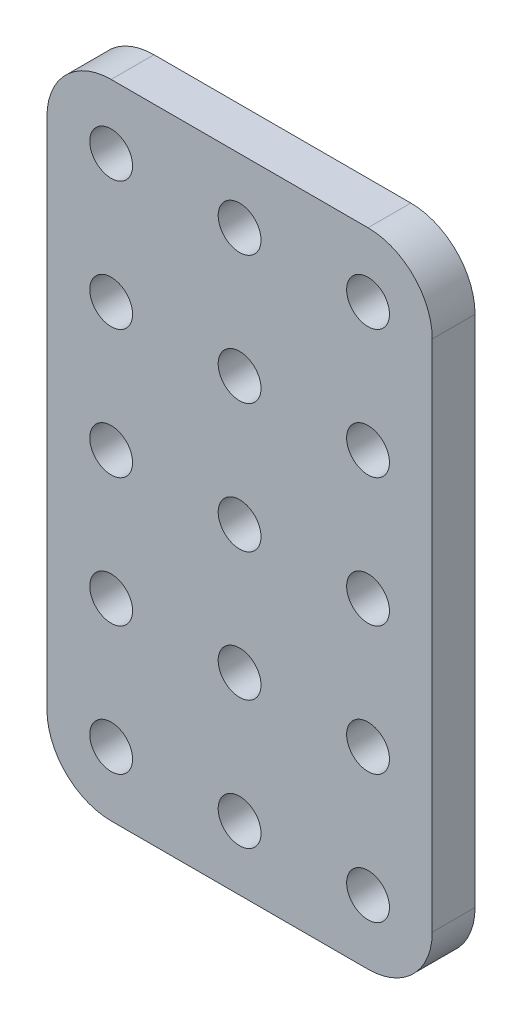
ISO-10303-21;
HEADER;
FILE_DESCRIPTION(('STEP AP214'),'2;1');
FILE_NAME('part.step','',(''),(''),'','','');
FILE_SCHEMA(('AUTOMOTIVE_DESIGN { 1 0 10303 214 1 1 1 1 }'));
ENDSEC;
DATA;
#1=APPLICATION_CONTEXT('core data for automotive mechanical design processes');
#2=APPLICATION_PROTOCOL_DEFINITION('international standard','automotive_design',2000,#1);
#3=PRODUCT_CONTEXT('',#1,'mechanical');
#4=PRODUCT('Part','Part','',(#3));
#5=PRODUCT_RELATED_PRODUCT_CATEGORY('part','',(#4));
#6=PRODUCT_DEFINITION_FORMATION('','',#4);
#7=PRODUCT_DEFINITION_CONTEXT('part definition',#1,'design');
#8=PRODUCT_DEFINITION('design','',#6,#7);
#9=PRODUCT_DEFINITION_SHAPE('','',#8);
#10=(LENGTH_UNIT() NAMED_UNIT(*) SI_UNIT(.MILLI.,.METRE.));
#11=(NAMED_UNIT(*) PLANE_ANGLE_UNIT() SI_UNIT($,.RADIAN.));
#12=(NAMED_UNIT(*) SI_UNIT($,.STERADIAN.) SOLID_ANGLE_UNIT());
#13=UNCERTAINTY_MEASURE_WITH_UNIT(LENGTH_MEASURE(1.E-05),#10,'distance_accuracy_value','');
#14=(GEOMETRIC_REPRESENTATION_CONTEXT(3) GLOBAL_UNCERTAINTY_ASSIGNED_CONTEXT((#13)) GLOBAL_UNIT_ASSIGNED_CONTEXT((#10,
#11,#12)) REPRESENTATION_CONTEXT('',''));
#15=CARTESIAN_POINT('',(0.,0.,0.));
#16=DIRECTION('',(0.,0.,1.));
#17=DIRECTION('',(1.,0.,0.));
#18=AXIS2_PLACEMENT_3D('',#15,#16,#17);
#19=CARTESIAN_POINT('',(-101.443383637,101.056539338,3.));
#20=DIRECTION('',(0.,0.,1.));
#21=DIRECTION('',(1.,0.,0.));
#22=AXIS2_PLACEMENT_3D('',#19,#20,#21);
#23=PLANE('',#22);
#24=CARTESIAN_POINT('',(-92.443383637,65.056539338,3.));
#25=DIRECTION('',(0.,0.,1.));
#26=DIRECTION('',(1.,0.,0.));
#27=AXIS2_PLACEMENT_3D('',#24,#25,#26);
#28=CIRCLE('',#27,1.5);
#29=CARTESIAN_POINT('',(-90.943383637,65.056539338,3.));
#30=VERTEX_POINT('',#29);
#31=EDGE_CURVE('E254',#30,#30,#28,.T.);
#32=ORIENTED_EDGE('',*,*,#31,.F.);
#33=EDGE_LOOP('',(#32));
#34=FACE_BOUND('',#33,.T.);
#35=CARTESIAN_POINT('',(-83.443383637,74.056539338,3.));
#36=DIRECTION('',(0.,0.,1.));
#37=DIRECTION('',(1.,0.,0.));
#38=AXIS2_PLACEMENT_3D('',#35,#36,#37);
#39=CIRCLE('',#38,1.5);
#40=CARTESIAN_POINT('',(-81.943383637,74.056539338,3.));
#41=VERTEX_POINT('',#40);
#42=EDGE_CURVE('E242',#41,#41,#39,.T.);
#43=ORIENTED_EDGE('',*,*,#42,.F.);
#44=EDGE_LOOP('',(#43));
#45=FACE_BOUND('',#44,.T.);
#46=CARTESIAN_POINT('',(-101.443383637,74.056539338,3.));
#47=DIRECTION('',(0.,0.,1.));
#48=DIRECTION('',(1.,0.,0.));
#49=AXIS2_PLACEMENT_3D('',#46,#47,#48);
#50=CIRCLE('',#49,1.5);
#51=CARTESIAN_POINT('',(-99.943383637,74.056539338,3.));
#52=VERTEX_POINT('',#51);
#53=EDGE_CURVE('E230',#52,#52,#50,.T.);
#54=ORIENTED_EDGE('',*,*,#53,.F.);
#55=EDGE_LOOP('',(#54));
#56=FACE_BOUND('',#55,.T.);
#57=CARTESIAN_POINT('',(-92.443383637,83.056539338,3.));
#58=DIRECTION('',(0.,0.,1.));
#59=DIRECTION('',(1.,0.,0.));
#60=AXIS2_PLACEMENT_3D('',#57,#58,#59);
#61=CIRCLE('',#60,1.5);
#62=CARTESIAN_POINT('',(-90.943383637,83.056539338,3.));
#63=VERTEX_POINT('',#62);
#64=EDGE_CURVE('E218',#63,#63,#61,.T.);
#65=ORIENTED_EDGE('',*,*,#64,.F.);
#66=EDGE_LOOP('',(#65));
#67=FACE_BOUND('',#66,.T.);
#68=CARTESIAN_POINT('',(-83.443383637,92.056539338,3.));
#69=DIRECTION('',(0.,0.,1.));
#70=DIRECTION('',(1.,0.,0.));
#71=AXIS2_PLACEMENT_3D('',#68,#69,#70);
#72=CIRCLE('',#71,1.5);
#73=CARTESIAN_POINT('',(-81.943383637,92.056539338,3.));
#74=VERTEX_POINT('',#73);
#75=EDGE_CURVE('E206',#74,#74,#72,.T.);
#76=ORIENTED_EDGE('',*,*,#75,.F.);
#77=EDGE_LOOP('',(#76));
#78=FACE_BOUND('',#77,.T.);
#79=CARTESIAN_POINT('',(-101.443383637,92.056539338,3.));
#80=DIRECTION('',(0.,0.,1.));
#81=DIRECTION('',(1.,0.,0.));
#82=AXIS2_PLACEMENT_3D('',#79,#80,#81);
#83=CIRCLE('',#82,1.5);
#84=CARTESIAN_POINT('',(-99.943383637,92.056539338,3.));
#85=VERTEX_POINT('',#84);
#86=EDGE_CURVE('E194',#85,#85,#83,.T.);
#87=ORIENTED_EDGE('',*,*,#86,.F.);
#88=EDGE_LOOP('',(#87));
#89=FACE_BOUND('',#88,.T.);
#90=CARTESIAN_POINT('',(-92.443383637,101.056539338,3.));
#91=DIRECTION('',(0.,0.,1.));
#92=DIRECTION('',(1.,0.,0.));
#93=AXIS2_PLACEMENT_3D('',#90,#91,#92);
#94=CIRCLE('',#93,1.5);
#95=CARTESIAN_POINT('',(-90.943383637,101.056539338,3.));
#96=VERTEX_POINT('',#95);
#97=EDGE_CURVE('E182',#96,#96,#94,.T.);
#98=ORIENTED_EDGE('',*,*,#97,.F.);
#99=EDGE_LOOP('',(#98));
#100=FACE_BOUND('',#99,.T.);
#101=CARTESIAN_POINT('',(-101.443383637,101.056539338,3.));
#102=DIRECTION('',(0.,0.,1.));
#103=DIRECTION('',(1.,0.,0.));
#104=AXIS2_PLACEMENT_3D('',#101,#102,#103);
#105=CIRCLE('',#104,4.5);
#106=CARTESIAN_POINT('',(-101.443383637,105.556539338,3.));
#107=VERTEX_POINT('',#106);
#108=CARTESIAN_POINT('',(-105.943383637,101.056539338,3.));
#109=VERTEX_POINT('',#108);
#110=EDGE_CURVE('E145',#107,#109,#105,.T.);
#111=ORIENTED_EDGE('',*,*,#110,.T.);
#112=DIRECTION('',(0.,-1.,0.));
#113=VECTOR('',#112,1.);
#114=CARTESIAN_POINT('',(-105.943383637,101.056539338,3.));
#115=LINE('',#114,#113);
#116=CARTESIAN_POINT('',(-105.943383637,65.056539338,3.));
#117=VERTEX_POINT('',#116);
#118=EDGE_CURVE('E93',#109,#117,#115,.T.);
#119=ORIENTED_EDGE('',*,*,#118,.T.);
#120=CARTESIAN_POINT('',(-101.443383637,65.056539338,3.));
#121=DIRECTION('',(0.,0.,1.));
#122=DIRECTION('',(1.,0.,0.));
#123=AXIS2_PLACEMENT_3D('',#120,#121,#122);
#124=CIRCLE('',#123,4.5);
#125=CARTESIAN_POINT('',(-101.443383637,60.556539338,3.));
#126=VERTEX_POINT('',#125);
#127=EDGE_CURVE('E160',#117,#126,#124,.T.);
#128=ORIENTED_EDGE('',*,*,#127,.T.);
#129=DIRECTION('',(1.,0.,0.));
#130=VECTOR('',#129,1.);
#131=CARTESIAN_POINT('',(-101.443383637,60.556539338,3.));
#132=LINE('',#131,#130);
#133=CARTESIAN_POINT('',(-83.443383637,60.556539338,3.));
#134=VERTEX_POINT('',#133);
#135=EDGE_CURVE('E173',#126,#134,#132,.T.);
#136=ORIENTED_EDGE('',*,*,#135,.T.);
#137=CARTESIAN_POINT('',(-83.443383637,65.056539338,3.));
#138=DIRECTION('',(0.,0.,1.));
#139=DIRECTION('',(1.,0.,0.));
#140=AXIS2_PLACEMENT_3D('',#137,#138,#139);
#141=CIRCLE('',#140,4.5);
#142=CARTESIAN_POINT('',(-78.943383637,65.056539338,3.));
#143=VERTEX_POINT('',#142);
#144=EDGE_CURVE('E112',#134,#143,#141,.T.);
#145=ORIENTED_EDGE('',*,*,#144,.T.);
#146=DIRECTION('',(0.,1.,0.));
#147=VECTOR('',#146,1.);
#148=CARTESIAN_POINT('',(-78.943383637,65.056539338,3.));
#149=LINE('',#148,#147);
#150=CARTESIAN_POINT('',(-78.943383637,101.056539338,3.));
#151=VERTEX_POINT('',#150);
#152=EDGE_CURVE('E106',#143,#151,#149,.T.);
#153=ORIENTED_EDGE('',*,*,#152,.T.);
#154=CARTESIAN_POINT('',(-83.443383637,101.056539338,3.));
#155=DIRECTION('',(0.,0.,1.));
#156=DIRECTION('',(1.,0.,0.));
#157=AXIS2_PLACEMENT_3D('',#154,#155,#156);
#158=CIRCLE('',#157,4.5);
#159=CARTESIAN_POINT('',(-83.443383637,105.556539338,3.));
#160=VERTEX_POINT('',#159);
#161=EDGE_CURVE('E110',#151,#160,#158,.T.);
#162=ORIENTED_EDGE('',*,*,#161,.T.);
#163=DIRECTION('',(-1.,0.,0.));
#164=VECTOR('',#163,1.);
#165=CARTESIAN_POINT('',(-83.443383637,105.556539338,3.));
#166=LINE('',#165,#164);
#167=EDGE_CURVE('E50',#160,#107,#166,.T.);
#168=ORIENTED_EDGE('',*,*,#167,.T.);
#169=EDGE_LOOP('',(#111,#119,#128,#136,#145,#153,#162,#168));
#170=FACE_BOUND('',#169,.T.);
#171=CARTESIAN_POINT('',(-101.443383637,101.056539338,3.));
#172=DIRECTION('',(0.,0.,1.));
#173=DIRECTION('',(1.,0.,0.));
#174=AXIS2_PLACEMENT_3D('',#171,#172,#173);
#175=CIRCLE('',#174,1.5);
#176=CARTESIAN_POINT('',(-99.943383637,101.056539338,3.));
#177=VERTEX_POINT('',#176);
#178=EDGE_CURVE('E134',#177,#177,#175,.T.);
#179=ORIENTED_EDGE('',*,*,#178,.F.);
#180=EDGE_LOOP('',(#179));
#181=FACE_BOUND('',#180,.T.);
#182=CARTESIAN_POINT('',(-83.443383637,101.056539338,3.));
#183=DIRECTION('',(0.,0.,1.));
#184=DIRECTION('',(1.,0.,0.));
#185=AXIS2_PLACEMENT_3D('',#182,#183,#184);
#186=CIRCLE('',#185,1.5);
#187=CARTESIAN_POINT('',(-81.943383637,101.056539338,3.));
#188=VERTEX_POINT('',#187);
#189=EDGE_CURVE('E188',#188,#188,#186,.T.);
#190=ORIENTED_EDGE('',*,*,#189,.F.);
#191=EDGE_LOOP('',(#190));
#192=FACE_BOUND('',#191,.T.);
#193=CARTESIAN_POINT('',(-92.443383637,92.056539338,3.));
#194=DIRECTION('',(0.,0.,1.));
#195=DIRECTION('',(1.,0.,0.));
#196=AXIS2_PLACEMENT_3D('',#193,#194,#195);
#197=CIRCLE('',#196,1.5);
#198=CARTESIAN_POINT('',(-90.943383637,92.056539338,3.));
#199=VERTEX_POINT('',#198);
#200=EDGE_CURVE('E200',#199,#199,#197,.T.);
#201=ORIENTED_EDGE('',*,*,#200,.F.);
#202=EDGE_LOOP('',(#201));
#203=FACE_BOUND('',#202,.T.);
#204=CARTESIAN_POINT('',(-101.443383637,83.056539338,3.));
#205=DIRECTION('',(0.,0.,1.));
#206=DIRECTION('',(1.,0.,0.));
#207=AXIS2_PLACEMENT_3D('',#204,#205,#206);
#208=CIRCLE('',#207,1.5);
#209=CARTESIAN_POINT('',(-99.943383637,83.056539338,3.));
#210=VERTEX_POINT('',#209);
#211=EDGE_CURVE('E212',#210,#210,#208,.T.);
#212=ORIENTED_EDGE('',*,*,#211,.F.);
#213=EDGE_LOOP('',(#212));
#214=FACE_BOUND('',#213,.T.);
#215=CARTESIAN_POINT('',(-83.443383637,83.056539338,3.));
#216=DIRECTION('',(0.,0.,1.));
#217=DIRECTION('',(1.,0.,0.));
#218=AXIS2_PLACEMENT_3D('',#215,#216,#217);
#219=CIRCLE('',#218,1.5);
#220=CARTESIAN_POINT('',(-81.943383637,83.056539338,3.));
#221=VERTEX_POINT('',#220);
#222=EDGE_CURVE('E224',#221,#221,#219,.T.);
#223=ORIENTED_EDGE('',*,*,#222,.F.);
#224=EDGE_LOOP('',(#223));
#225=FACE_BOUND('',#224,.T.);
#226=CARTESIAN_POINT('',(-92.443383637,74.056539338,3.));
#227=DIRECTION('',(0.,0.,1.));
#228=DIRECTION('',(1.,0.,0.));
#229=AXIS2_PLACEMENT_3D('',#226,#227,#228);
#230=CIRCLE('',#229,1.5);
#231=CARTESIAN_POINT('',(-90.943383637,74.056539338,3.));
#232=VERTEX_POINT('',#231);
#233=EDGE_CURVE('E236',#232,#232,#230,.T.);
#234=ORIENTED_EDGE('',*,*,#233,.F.);
#235=EDGE_LOOP('',(#234));
#236=FACE_BOUND('',#235,.T.);
#237=CARTESIAN_POINT('',(-101.443383637,65.056539338,3.));
#238=DIRECTION('',(0.,0.,1.));
#239=DIRECTION('',(1.,0.,0.));
#240=AXIS2_PLACEMENT_3D('',#237,#238,#239);
#241=CIRCLE('',#240,1.5);
#242=CARTESIAN_POINT('',(-99.943383637,65.056539338,3.));
#243=VERTEX_POINT('',#242);
#244=EDGE_CURVE('E248',#243,#243,#241,.T.);
#245=ORIENTED_EDGE('',*,*,#244,.F.);
#246=EDGE_LOOP('',(#245));
#247=FACE_BOUND('',#246,.T.);
#248=CARTESIAN_POINT('',(-83.443383637,65.056539338,3.));
#249=DIRECTION('',(0.,0.,1.));
#250=DIRECTION('',(1.,0.,0.));
#251=AXIS2_PLACEMENT_3D('',#248,#249,#250);
#252=CIRCLE('',#251,1.5);
#253=CARTESIAN_POINT('',(-81.943383637,65.056539338,3.));
#254=VERTEX_POINT('',#253);
#255=EDGE_CURVE('E260',#254,#254,#252,.T.);
#256=ORIENTED_EDGE('',*,*,#255,.F.);
#257=EDGE_LOOP('',(#256));
#258=FACE_BOUND('',#257,.T.);
#259=ADVANCED_FACE('F33',(#34,#45,#56,#67,#78,#89,#100,#170,#181,#192,#203,#214,#225,#236,#247,
#258),#23,.T.);
#260=CARTESIAN_POINT('',(-101.443383637,101.056539338,0.));
#261=DIRECTION('',(0.,0.,1.));
#262=DIRECTION('',(1.,0.,0.));
#263=AXIS2_PLACEMENT_3D('',#260,#261,#262);
#264=PLANE('',#263);
#265=CARTESIAN_POINT('',(-92.443383637,65.056539338,0.));
#266=DIRECTION('',(0.,0.,1.));
#267=DIRECTION('',(1.,0.,0.));
#268=AXIS2_PLACEMENT_3D('',#265,#266,#267);
#269=CIRCLE('',#268,1.5);
#270=CARTESIAN_POINT('',(-90.943383637,65.056539338,0.));
#271=VERTEX_POINT('',#270);
#272=EDGE_CURVE('E257',#271,#271,#269,.T.);
#273=ORIENTED_EDGE('',*,*,#272,.T.);
#274=EDGE_LOOP('',(#273));
#275=FACE_BOUND('',#274,.T.);
#276=CARTESIAN_POINT('',(-83.443383637,74.056539338,0.));
#277=DIRECTION('',(0.,0.,1.));
#278=DIRECTION('',(1.,0.,0.));
#279=AXIS2_PLACEMENT_3D('',#276,#277,#278);
#280=CIRCLE('',#279,1.5);
#281=CARTESIAN_POINT('',(-81.943383637,74.056539338,0.));
#282=VERTEX_POINT('',#281);
#283=EDGE_CURVE('E245',#282,#282,#280,.T.);
#284=ORIENTED_EDGE('',*,*,#283,.T.);
#285=EDGE_LOOP('',(#284));
#286=FACE_BOUND('',#285,.T.);
#287=CARTESIAN_POINT('',(-101.443383637,74.056539338,0.));
#288=DIRECTION('',(0.,0.,1.));
#289=DIRECTION('',(1.,0.,0.));
#290=AXIS2_PLACEMENT_3D('',#287,#288,#289);
#291=CIRCLE('',#290,1.5);
#292=CARTESIAN_POINT('',(-99.943383637,74.056539338,0.));
#293=VERTEX_POINT('',#292);
#294=EDGE_CURVE('E233',#293,#293,#291,.T.);
#295=ORIENTED_EDGE('',*,*,#294,.T.);
#296=EDGE_LOOP('',(#295));
#297=FACE_BOUND('',#296,.T.);
#298=CARTESIAN_POINT('',(-92.443383637,83.056539338,0.));
#299=DIRECTION('',(0.,0.,1.));
#300=DIRECTION('',(1.,0.,0.));
#301=AXIS2_PLACEMENT_3D('',#298,#299,#300);
#302=CIRCLE('',#301,1.5);
#303=CARTESIAN_POINT('',(-90.943383637,83.056539338,0.));
#304=VERTEX_POINT('',#303);
#305=EDGE_CURVE('E221',#304,#304,#302,.T.);
#306=ORIENTED_EDGE('',*,*,#305,.T.);
#307=EDGE_LOOP('',(#306));
#308=FACE_BOUND('',#307,.T.);
#309=CARTESIAN_POINT('',(-83.443383637,92.056539338,0.));
#310=DIRECTION('',(0.,0.,1.));
#311=DIRECTION('',(1.,0.,0.));
#312=AXIS2_PLACEMENT_3D('',#309,#310,#311);
#313=CIRCLE('',#312,1.5);
#314=CARTESIAN_POINT('',(-81.943383637,92.056539338,0.));
#315=VERTEX_POINT('',#314);
#316=EDGE_CURVE('E209',#315,#315,#313,.T.);
#317=ORIENTED_EDGE('',*,*,#316,.T.);
#318=EDGE_LOOP('',(#317));
#319=FACE_BOUND('',#318,.T.);
#320=CARTESIAN_POINT('',(-101.443383637,92.056539338,0.));
#321=DIRECTION('',(0.,0.,1.));
#322=DIRECTION('',(1.,0.,0.));
#323=AXIS2_PLACEMENT_3D('',#320,#321,#322);
#324=CIRCLE('',#323,1.5);
#325=CARTESIAN_POINT('',(-99.943383637,92.056539338,0.));
#326=VERTEX_POINT('',#325);
#327=EDGE_CURVE('E197',#326,#326,#324,.T.);
#328=ORIENTED_EDGE('',*,*,#327,.T.);
#329=EDGE_LOOP('',(#328));
#330=FACE_BOUND('',#329,.T.);
#331=CARTESIAN_POINT('',(-92.443383637,101.056539338,0.));
#332=DIRECTION('',(0.,0.,1.));
#333=DIRECTION('',(1.,0.,0.));
#334=AXIS2_PLACEMENT_3D('',#331,#332,#333);
#335=CIRCLE('',#334,1.5);
#336=CARTESIAN_POINT('',(-90.943383637,101.056539338,0.));
#337=VERTEX_POINT('',#336);
#338=EDGE_CURVE('E185',#337,#337,#335,.T.);
#339=ORIENTED_EDGE('',*,*,#338,.T.);
#340=EDGE_LOOP('',(#339));
#341=FACE_BOUND('',#340,.T.);
#342=CARTESIAN_POINT('',(-101.443383637,101.056539338,0.));
#343=DIRECTION('',(0.,0.,1.));
#344=DIRECTION('',(1.,0.,0.));
#345=AXIS2_PLACEMENT_3D('',#342,#343,#344);
#346=CIRCLE('',#345,4.5);
#347=CARTESIAN_POINT('',(-101.443383637,105.556539338,0.));
#348=VERTEX_POINT('',#347);
#349=CARTESIAN_POINT('',(-105.943383637,101.056539338,0.));
#350=VERTEX_POINT('',#349);
#351=EDGE_CURVE('E130',#348,#350,#346,.T.);
#352=ORIENTED_EDGE('',*,*,#351,.F.);
#353=DIRECTION('',(-1.,0.,0.));
#354=VECTOR('',#353,1.);
#355=CARTESIAN_POINT('',(-83.443383637,105.556539338,0.));
#356=LINE('',#355,#354);
#357=CARTESIAN_POINT('',(-83.443383637,105.556539338,0.));
#358=VERTEX_POINT('',#357);
#359=EDGE_CURVE('E85',#358,#348,#356,.T.);
#360=ORIENTED_EDGE('',*,*,#359,.F.);
#361=CARTESIAN_POINT('',(-83.443383637,101.056539338,0.));
#362=DIRECTION('',(0.,0.,1.));
#363=DIRECTION('',(1.,0.,0.));
#364=AXIS2_PLACEMENT_3D('',#361,#362,#363);
#365=CIRCLE('',#364,4.5);
#366=CARTESIAN_POINT('',(-78.943383637,101.056539338,0.));
#367=VERTEX_POINT('',#366);
#368=EDGE_CURVE('E79',#367,#358,#365,.T.);
#369=ORIENTED_EDGE('',*,*,#368,.F.);
#370=DIRECTION('',(0.,1.,0.));
#371=VECTOR('',#370,1.);
#372=CARTESIAN_POINT('',(-78.943383637,65.056539338,0.));
#373=LINE('',#372,#371);
#374=CARTESIAN_POINT('',(-78.943383637,65.056539338,0.));
#375=VERTEX_POINT('',#374);
#376=EDGE_CURVE('E120',#375,#367,#373,.T.);
#377=ORIENTED_EDGE('',*,*,#376,.F.);
#378=CARTESIAN_POINT('',(-83.443383637,65.056539338,0.));
#379=DIRECTION('',(0.,0.,1.));
#380=DIRECTION('',(1.,0.,0.));
#381=AXIS2_PLACEMENT_3D('',#378,#379,#380);
#382=CIRCLE('',#381,4.5);
#383=CARTESIAN_POINT('',(-83.443383637,60.556539338,0.));
#384=VERTEX_POINT('',#383);
#385=EDGE_CURVE('E140',#384,#375,#382,.T.);
#386=ORIENTED_EDGE('',*,*,#385,.F.);
#387=DIRECTION('',(1.,0.,0.));
#388=VECTOR('',#387,1.);
#389=CARTESIAN_POINT('',(-101.443383637,60.556539338,0.));
#390=LINE('',#389,#388);
#391=CARTESIAN_POINT('',(-101.443383637,60.556539338,0.));
#392=VERTEX_POINT('',#391);
#393=EDGE_CURVE('E138',#392,#384,#390,.T.);
#394=ORIENTED_EDGE('',*,*,#393,.F.);
#395=CARTESIAN_POINT('',(-101.443383637,65.056539338,0.));
#396=DIRECTION('',(0.,0.,1.));
#397=DIRECTION('',(1.,0.,0.));
#398=AXIS2_PLACEMENT_3D('',#395,#396,#397);
#399=CIRCLE('',#398,4.5);
#400=CARTESIAN_POINT('',(-105.943383637,65.056539338,0.));
#401=VERTEX_POINT('',#400);
#402=EDGE_CURVE('E136',#401,#392,#399,.T.);
#403=ORIENTED_EDGE('',*,*,#402,.F.);
#404=DIRECTION('',(0.,-1.,0.));
#405=VECTOR('',#404,1.);
#406=CARTESIAN_POINT('',(-105.943383637,101.056539338,0.));
#407=LINE('',#406,#405);
#408=EDGE_CURVE('E133',#350,#401,#407,.T.);
#409=ORIENTED_EDGE('',*,*,#408,.F.);
#410=EDGE_LOOP('',(#352,#360,#369,#377,#386,#394,#403,#409));
#411=FACE_BOUND('',#410,.T.);
#412=CARTESIAN_POINT('',(-101.443383637,101.056539338,0.));
#413=DIRECTION('',(0.,0.,1.));
#414=DIRECTION('',(1.,0.,0.));
#415=AXIS2_PLACEMENT_3D('',#412,#413,#414);
#416=CIRCLE('',#415,1.5);
#417=CARTESIAN_POINT('',(-99.943383637,101.056539338,0.));
#418=VERTEX_POINT('',#417);
#419=EDGE_CURVE('E179',#418,#418,#416,.T.);
#420=ORIENTED_EDGE('',*,*,#419,.T.);
#421=EDGE_LOOP('',(#420));
#422=FACE_BOUND('',#421,.T.);
#423=CARTESIAN_POINT('',(-83.443383637,101.056539338,0.));
#424=DIRECTION('',(0.,0.,1.));
#425=DIRECTION('',(1.,0.,0.));
#426=AXIS2_PLACEMENT_3D('',#423,#424,#425);
#427=CIRCLE('',#426,1.5);
#428=CARTESIAN_POINT('',(-81.943383637,101.056539338,0.));
#429=VERTEX_POINT('',#428);
#430=EDGE_CURVE('E191',#429,#429,#427,.T.);
#431=ORIENTED_EDGE('',*,*,#430,.T.);
#432=EDGE_LOOP('',(#431));
#433=FACE_BOUND('',#432,.T.);
#434=CARTESIAN_POINT('',(-92.443383637,92.056539338,0.));
#435=DIRECTION('',(0.,0.,1.));
#436=DIRECTION('',(1.,0.,0.));
#437=AXIS2_PLACEMENT_3D('',#434,#435,#436);
#438=CIRCLE('',#437,1.5);
#439=CARTESIAN_POINT('',(-90.943383637,92.056539338,0.));
#440=VERTEX_POINT('',#439);
#441=EDGE_CURVE('E203',#440,#440,#438,.T.);
#442=ORIENTED_EDGE('',*,*,#441,.T.);
#443=EDGE_LOOP('',(#442));
#444=FACE_BOUND('',#443,.T.);
#445=CARTESIAN_POINT('',(-101.443383637,83.056539338,0.));
#446=DIRECTION('',(0.,0.,1.));
#447=DIRECTION('',(1.,0.,0.));
#448=AXIS2_PLACEMENT_3D('',#445,#446,#447);
#449=CIRCLE('',#448,1.5);
#450=CARTESIAN_POINT('',(-99.943383637,83.056539338,0.));
#451=VERTEX_POINT('',#450);
#452=EDGE_CURVE('E215',#451,#451,#449,.T.);
#453=ORIENTED_EDGE('',*,*,#452,.T.);
#454=EDGE_LOOP('',(#453));
#455=FACE_BOUND('',#454,.T.);
#456=CARTESIAN_POINT('',(-83.443383637,83.056539338,0.));
#457=DIRECTION('',(0.,0.,1.));
#458=DIRECTION('',(1.,0.,0.));
#459=AXIS2_PLACEMENT_3D('',#456,#457,#458);
#460=CIRCLE('',#459,1.5);
#461=CARTESIAN_POINT('',(-81.943383637,83.056539338,0.));
#462=VERTEX_POINT('',#461);
#463=EDGE_CURVE('E227',#462,#462,#460,.T.);
#464=ORIENTED_EDGE('',*,*,#463,.T.);
#465=EDGE_LOOP('',(#464));
#466=FACE_BOUND('',#465,.T.);
#467=CARTESIAN_POINT('',(-92.443383637,74.056539338,0.));
#468=DIRECTION('',(0.,0.,1.));
#469=DIRECTION('',(1.,0.,0.));
#470=AXIS2_PLACEMENT_3D('',#467,#468,#469);
#471=CIRCLE('',#470,1.5);
#472=CARTESIAN_POINT('',(-90.943383637,74.056539338,0.));
#473=VERTEX_POINT('',#472);
#474=EDGE_CURVE('E239',#473,#473,#471,.T.);
#475=ORIENTED_EDGE('',*,*,#474,.T.);
#476=EDGE_LOOP('',(#475));
#477=FACE_BOUND('',#476,.T.);
#478=CARTESIAN_POINT('',(-101.443383637,65.056539338,0.));
#479=DIRECTION('',(0.,0.,1.));
#480=DIRECTION('',(1.,0.,0.));
#481=AXIS2_PLACEMENT_3D('',#478,#479,#480);
#482=CIRCLE('',#481,1.5);
#483=CARTESIAN_POINT('',(-99.943383637,65.056539338,0.));
#484=VERTEX_POINT('',#483);
#485=EDGE_CURVE('E251',#484,#484,#482,.T.);
#486=ORIENTED_EDGE('',*,*,#485,.T.);
#487=EDGE_LOOP('',(#486));
#488=FACE_BOUND('',#487,.T.);
#489=CARTESIAN_POINT('',(-83.443383637,65.056539338,0.));
#490=DIRECTION('',(0.,0.,1.));
#491=DIRECTION('',(1.,0.,0.));
#492=AXIS2_PLACEMENT_3D('',#489,#490,#491);
#493=CIRCLE('',#492,1.5);
#494=CARTESIAN_POINT('',(-81.943383637,65.056539338,0.));
#495=VERTEX_POINT('',#494);
#496=EDGE_CURVE('E263',#495,#495,#493,.T.);
#497=ORIENTED_EDGE('',*,*,#496,.T.);
#498=EDGE_LOOP('',(#497));
#499=FACE_BOUND('',#498,.T.);
#500=ADVANCED_FACE('F164',(#275,#286,#297,#308,#319,#330,#341,#411,#422,#433,#444,#455,#466,
#477,#488,#499),#264,.F.);
#501=CARTESIAN_POINT('',(-101.443383637,101.056539338,3.));
#502=DIRECTION('',(0.,0.,-1.));
#503=DIRECTION('',(-1.,0.,0.));
#504=AXIS2_PLACEMENT_3D('',#501,#502,#503);
#505=CYLINDRICAL_SURFACE('',#504,4.5);
#506=ORIENTED_EDGE('',*,*,#351,.T.);
#507=DIRECTION('',(0.,0.,-1.));
#508=VECTOR('',#507,1.);
#509=CARTESIAN_POINT('',(-105.943383637,101.056539338,3.));
#510=LINE('',#509,#508);
#511=EDGE_CURVE('E11',#109,#350,#510,.T.);
#512=ORIENTED_EDGE('',*,*,#511,.F.);
#513=ORIENTED_EDGE('',*,*,#110,.F.);
#514=DIRECTION('',(0.,0.,-1.));
#515=VECTOR('',#514,1.);
#516=CARTESIAN_POINT('',(-101.443383637,105.556539338,3.));
#517=LINE('',#516,#515);
#518=EDGE_CURVE('E126',#107,#348,#517,.T.);
#519=ORIENTED_EDGE('',*,*,#518,.T.);
#520=EDGE_LOOP('',(#506,#512,#513,#519));
#521=FACE_BOUND('',#520,.T.);
#522=ADVANCED_FACE('F35',(#521),#505,.T.);
#523=CARTESIAN_POINT('',(-105.943383637,101.056539338,3.));
#524=DIRECTION('',(1.,0.,0.));
#525=DIRECTION('',(0.,0.,-1.));
#526=AXIS2_PLACEMENT_3D('',#523,#524,#525);
#527=PLANE('',#526);
#528=ORIENTED_EDGE('',*,*,#408,.T.);
#529=DIRECTION('',(0.,0.,-1.));
#530=VECTOR('',#529,1.);
#531=CARTESIAN_POINT('',(-105.943383637,65.056539338,3.));
#532=LINE('',#531,#530);
#533=EDGE_CURVE('E42',#117,#401,#532,.T.);
#534=ORIENTED_EDGE('',*,*,#533,.F.);
#535=ORIENTED_EDGE('',*,*,#118,.F.);
#536=ORIENTED_EDGE('',*,*,#511,.T.);
#537=EDGE_LOOP('',(#528,#534,#535,#536));
#538=FACE_BOUND('',#537,.T.);
#539=ADVANCED_FACE('F298',(#538),#527,.F.);
#540=CARTESIAN_POINT('',(-101.443383637,65.056539338,3.));
#541=DIRECTION('',(0.,0.,-1.));
#542=DIRECTION('',(-1.,0.,0.));
#543=AXIS2_PLACEMENT_3D('',#540,#541,#542);
#544=CYLINDRICAL_SURFACE('',#543,4.5);
#545=ORIENTED_EDGE('',*,*,#402,.T.);
#546=DIRECTION('',(0.,0.,-1.));
#547=VECTOR('',#546,1.);
#548=CARTESIAN_POINT('',(-101.443383637,60.556539338,3.));
#549=LINE('',#548,#547);
#550=EDGE_CURVE('E152',#126,#392,#549,.T.);
#551=ORIENTED_EDGE('',*,*,#550,.F.);
#552=ORIENTED_EDGE('',*,*,#127,.F.);
#553=ORIENTED_EDGE('',*,*,#533,.T.);
#554=EDGE_LOOP('',(#545,#551,#552,#553));
#555=FACE_BOUND('',#554,.T.);
#556=ADVANCED_FACE('F158',(#555),#544,.T.);
#557=CARTESIAN_POINT('',(-101.443383637,60.556539338,3.));
#558=DIRECTION('',(0.,1.,0.));
#559=DIRECTION('',(0.,0.,1.));
#560=AXIS2_PLACEMENT_3D('',#557,#558,#559);
#561=PLANE('',#560);
#562=ORIENTED_EDGE('',*,*,#393,.T.);
#563=DIRECTION('',(0.,0.,-1.));
#564=VECTOR('',#563,1.);
#565=CARTESIAN_POINT('',(-83.443383637,60.556539338,3.));
#566=LINE('',#565,#564);
#567=EDGE_CURVE('E149',#134,#384,#566,.T.);
#568=ORIENTED_EDGE('',*,*,#567,.F.);
#569=ORIENTED_EDGE('',*,*,#135,.F.);
#570=ORIENTED_EDGE('',*,*,#550,.T.);
#571=EDGE_LOOP('',(#562,#568,#569,#570));
#572=FACE_BOUND('',#571,.T.);
#573=ADVANCED_FACE('F169',(#572),#561,.F.);
#574=CARTESIAN_POINT('',(-83.443383637,65.056539338,3.));
#575=DIRECTION('',(0.,0.,-1.));
#576=DIRECTION('',(-1.,0.,0.));
#577=AXIS2_PLACEMENT_3D('',#574,#575,#576);
#578=CYLINDRICAL_SURFACE('',#577,4.5);
#579=ORIENTED_EDGE('',*,*,#385,.T.);
#580=DIRECTION('',(0.,0.,-1.));
#581=VECTOR('',#580,1.);
#582=CARTESIAN_POINT('',(-78.943383637,65.056539338,3.));
#583=LINE('',#582,#581);
#584=EDGE_CURVE('E121',#143,#375,#583,.T.);
#585=ORIENTED_EDGE('',*,*,#584,.F.);
#586=ORIENTED_EDGE('',*,*,#144,.F.);
#587=ORIENTED_EDGE('',*,*,#567,.T.);
#588=EDGE_LOOP('',(#579,#585,#586,#587));
#589=FACE_BOUND('',#588,.T.);
#590=ADVANCED_FACE('F172',(#589),#578,.T.);
#591=CARTESIAN_POINT('',(-78.943383637,65.056539338,3.));
#592=DIRECTION('',(-1.,0.,0.));
#593=DIRECTION('',(0.,0.,1.));
#594=AXIS2_PLACEMENT_3D('',#591,#592,#593);
#595=PLANE('',#594);
#596=ORIENTED_EDGE('',*,*,#376,.T.);
#597=DIRECTION('',(0.,0.,-1.));
#598=VECTOR('',#597,1.);
#599=CARTESIAN_POINT('',(-78.943383637,101.056539338,3.));
#600=LINE('',#599,#598);
#601=EDGE_CURVE('E117',#151,#367,#600,.T.);
#602=ORIENTED_EDGE('',*,*,#601,.F.);
#603=ORIENTED_EDGE('',*,*,#152,.F.);
#604=ORIENTED_EDGE('',*,*,#584,.T.);
#605=EDGE_LOOP('',(#596,#602,#603,#604));
#606=FACE_BOUND('',#605,.T.);
#607=ADVANCED_FACE('F118',(#606),#595,.F.);
#608=CARTESIAN_POINT('',(-83.443383637,101.056539338,3.));
#609=DIRECTION('',(0.,0.,-1.));
#610=DIRECTION('',(-1.,0.,0.));
#611=AXIS2_PLACEMENT_3D('',#608,#609,#610);
#612=CYLINDRICAL_SURFACE('',#611,4.5);
#613=ORIENTED_EDGE('',*,*,#368,.T.);
#614=DIRECTION('',(0.,0.,-1.));
#615=VECTOR('',#614,1.);
#616=CARTESIAN_POINT('',(-83.443383637,105.556539338,3.));
#617=LINE('',#616,#615);
#618=EDGE_CURVE('E122',#160,#358,#617,.T.);
#619=ORIENTED_EDGE('',*,*,#618,.F.);
#620=ORIENTED_EDGE('',*,*,#161,.F.);
#621=ORIENTED_EDGE('',*,*,#601,.T.);
#622=EDGE_LOOP('',(#613,#619,#620,#621));
#623=FACE_BOUND('',#622,.T.);
#624=ADVANCED_FACE('F124',(#623),#612,.T.);
#625=CARTESIAN_POINT('',(-83.443383637,105.556539338,3.));
#626=DIRECTION('',(0.,-1.,0.));
#627=DIRECTION('',(0.,0.,-1.));
#628=AXIS2_PLACEMENT_3D('',#625,#626,#627);
#629=PLANE('',#628);
#630=ORIENTED_EDGE('',*,*,#359,.T.);
#631=ORIENTED_EDGE('',*,*,#518,.F.);
#632=ORIENTED_EDGE('',*,*,#167,.F.);
#633=ORIENTED_EDGE('',*,*,#618,.T.);
#634=EDGE_LOOP('',(#630,#631,#632,#633));
#635=FACE_BOUND('',#634,.T.);
#636=ADVANCED_FACE('F286',(#635),#629,.F.);
#637=CARTESIAN_POINT('',(-101.443383637,101.056539338,3.));
#638=DIRECTION('',(0.,0.,-1.));
#639=DIRECTION('',(-1.,0.,0.));
#640=AXIS2_PLACEMENT_3D('',#637,#638,#639);
#641=CYLINDRICAL_SURFACE('',#640,1.5);
#642=ORIENTED_EDGE('',*,*,#178,.T.);
#643=EDGE_LOOP('',(#642));
#644=FACE_BOUND('',#643,.T.);
#645=ORIENTED_EDGE('',*,*,#419,.F.);
#646=EDGE_LOOP('',(#645));
#647=FACE_BOUND('',#646,.T.);
#648=ADVANCED_FACE('F283',(#644,#647),#641,.F.);
#649=CARTESIAN_POINT('',(-92.443383637,101.056539338,3.));
#650=DIRECTION('',(0.,0.,-1.));
#651=DIRECTION('',(-1.,0.,0.));
#652=AXIS2_PLACEMENT_3D('',#649,#650,#651);
#653=CYLINDRICAL_SURFACE('',#652,1.5);
#654=ORIENTED_EDGE('',*,*,#97,.T.);
#655=EDGE_LOOP('',(#654));
#656=FACE_BOUND('',#655,.T.);
#657=ORIENTED_EDGE('',*,*,#338,.F.);
#658=EDGE_LOOP('',(#657));
#659=FACE_BOUND('',#658,.T.);
#660=ADVANCED_FACE('F362',(#656,#659),#653,.F.);
#661=CARTESIAN_POINT('',(-83.443383637,101.056539338,3.));
#662=DIRECTION('',(0.,0.,-1.));
#663=DIRECTION('',(-1.,0.,0.));
#664=AXIS2_PLACEMENT_3D('',#661,#662,#663);
#665=CYLINDRICAL_SURFACE('',#664,1.5);
#666=ORIENTED_EDGE('',*,*,#189,.T.);
#667=EDGE_LOOP('',(#666));
#668=FACE_BOUND('',#667,.T.);
#669=ORIENTED_EDGE('',*,*,#430,.F.);
#670=EDGE_LOOP('',(#669));
#671=FACE_BOUND('',#670,.T.);
#672=ADVANCED_FACE('F370',(#668,#671),#665,.F.);
#673=CARTESIAN_POINT('',(-101.443383637,92.056539338,3.));
#674=DIRECTION('',(0.,0.,-1.));
#675=DIRECTION('',(-1.,0.,0.));
#676=AXIS2_PLACEMENT_3D('',#673,#674,#675);
#677=CYLINDRICAL_SURFACE('',#676,1.5);
#678=ORIENTED_EDGE('',*,*,#86,.T.);
#679=EDGE_LOOP('',(#678));
#680=FACE_BOUND('',#679,.T.);
#681=ORIENTED_EDGE('',*,*,#327,.F.);
#682=EDGE_LOOP('',(#681));
#683=FACE_BOUND('',#682,.T.);
#684=ADVANCED_FACE('F378',(#680,#683),#677,.F.);
#685=CARTESIAN_POINT('',(-92.443383637,92.056539338,3.));
#686=DIRECTION('',(0.,0.,-1.));
#687=DIRECTION('',(-1.,0.,0.));
#688=AXIS2_PLACEMENT_3D('',#685,#686,#687);
#689=CYLINDRICAL_SURFACE('',#688,1.5);
#690=ORIENTED_EDGE('',*,*,#200,.T.);
#691=EDGE_LOOP('',(#690));
#692=FACE_BOUND('',#691,.T.);
#693=ORIENTED_EDGE('',*,*,#441,.F.);
#694=EDGE_LOOP('',(#693));
#695=FACE_BOUND('',#694,.T.);
#696=ADVANCED_FACE('F387',(#692,#695),#689,.F.);
#697=CARTESIAN_POINT('',(-83.443383637,92.056539338,3.));
#698=DIRECTION('',(0.,0.,-1.));
#699=DIRECTION('',(-1.,0.,0.));
#700=AXIS2_PLACEMENT_3D('',#697,#698,#699);
#701=CYLINDRICAL_SURFACE('',#700,1.5);
#702=ORIENTED_EDGE('',*,*,#75,.T.);
#703=EDGE_LOOP('',(#702));
#704=FACE_BOUND('',#703,.T.);
#705=ORIENTED_EDGE('',*,*,#316,.F.);
#706=EDGE_LOOP('',(#705));
#707=FACE_BOUND('',#706,.T.);
#708=ADVANCED_FACE('F396',(#704,#707),#701,.F.);
#709=CARTESIAN_POINT('',(-101.443383637,83.056539338,3.));
#710=DIRECTION('',(0.,0.,-1.));
#711=DIRECTION('',(-1.,0.,0.));
#712=AXIS2_PLACEMENT_3D('',#709,#710,#711);
#713=CYLINDRICAL_SURFACE('',#712,1.5);
#714=ORIENTED_EDGE('',*,*,#211,.T.);
#715=EDGE_LOOP('',(#714));
#716=FACE_BOUND('',#715,.T.);
#717=ORIENTED_EDGE('',*,*,#452,.F.);
#718=EDGE_LOOP('',(#717));
#719=FACE_BOUND('',#718,.T.);
#720=ADVANCED_FACE('F405',(#716,#719),#713,.F.);
#721=CARTESIAN_POINT('',(-92.443383637,83.056539338,3.));
#722=DIRECTION('',(0.,0.,-1.));
#723=DIRECTION('',(-1.,0.,0.));
#724=AXIS2_PLACEMENT_3D('',#721,#722,#723);
#725=CYLINDRICAL_SURFACE('',#724,1.5);
#726=ORIENTED_EDGE('',*,*,#64,.T.);
#727=EDGE_LOOP('',(#726));
#728=FACE_BOUND('',#727,.T.);
#729=ORIENTED_EDGE('',*,*,#305,.F.);
#730=EDGE_LOOP('',(#729));
#731=FACE_BOUND('',#730,.T.);
#732=ADVANCED_FACE('F414',(#728,#731),#725,.F.);
#733=CARTESIAN_POINT('',(-83.443383637,83.056539338,3.));
#734=DIRECTION('',(0.,0.,-1.));
#735=DIRECTION('',(-1.,0.,0.));
#736=AXIS2_PLACEMENT_3D('',#733,#734,#735);
#737=CYLINDRICAL_SURFACE('',#736,1.5);
#738=ORIENTED_EDGE('',*,*,#222,.T.);
#739=EDGE_LOOP('',(#738));
#740=FACE_BOUND('',#739,.T.);
#741=ORIENTED_EDGE('',*,*,#463,.F.);
#742=EDGE_LOOP('',(#741));
#743=FACE_BOUND('',#742,.T.);
#744=ADVANCED_FACE('F423',(#740,#743),#737,.F.);
#745=CARTESIAN_POINT('',(-101.443383637,74.056539338,3.));
#746=DIRECTION('',(0.,0.,-1.));
#747=DIRECTION('',(-1.,0.,0.));
#748=AXIS2_PLACEMENT_3D('',#745,#746,#747);
#749=CYLINDRICAL_SURFACE('',#748,1.5);
#750=ORIENTED_EDGE('',*,*,#53,.T.);
#751=EDGE_LOOP('',(#750));
#752=FACE_BOUND('',#751,.T.);
#753=ORIENTED_EDGE('',*,*,#294,.F.);
#754=EDGE_LOOP('',(#753));
#755=FACE_BOUND('',#754,.T.);
#756=ADVANCED_FACE('F432',(#752,#755),#749,.F.);
#757=CARTESIAN_POINT('',(-92.443383637,74.056539338,3.));
#758=DIRECTION('',(0.,0.,-1.));
#759=DIRECTION('',(-1.,0.,0.));
#760=AXIS2_PLACEMENT_3D('',#757,#758,#759);
#761=CYLINDRICAL_SURFACE('',#760,1.5);
#762=ORIENTED_EDGE('',*,*,#233,.T.);
#763=EDGE_LOOP('',(#762));
#764=FACE_BOUND('',#763,.T.);
#765=ORIENTED_EDGE('',*,*,#474,.F.);
#766=EDGE_LOOP('',(#765));
#767=FACE_BOUND('',#766,.T.);
#768=ADVANCED_FACE('F441',(#764,#767),#761,.F.);
#769=CARTESIAN_POINT('',(-83.443383637,74.056539338,3.));
#770=DIRECTION('',(0.,0.,-1.));
#771=DIRECTION('',(-1.,0.,0.));
#772=AXIS2_PLACEMENT_3D('',#769,#770,#771);
#773=CYLINDRICAL_SURFACE('',#772,1.5);
#774=ORIENTED_EDGE('',*,*,#42,.T.);
#775=EDGE_LOOP('',(#774));
#776=FACE_BOUND('',#775,.T.);
#777=ORIENTED_EDGE('',*,*,#283,.F.);
#778=EDGE_LOOP('',(#777));
#779=FACE_BOUND('',#778,.T.);
#780=ADVANCED_FACE('F450',(#776,#779),#773,.F.);
#781=CARTESIAN_POINT('',(-101.443383637,65.056539338,3.));
#782=DIRECTION('',(0.,0.,-1.));
#783=DIRECTION('',(-1.,0.,0.));
#784=AXIS2_PLACEMENT_3D('',#781,#782,#783);
#785=CYLINDRICAL_SURFACE('',#784,1.5);
#786=ORIENTED_EDGE('',*,*,#244,.T.);
#787=EDGE_LOOP('',(#786));
#788=FACE_BOUND('',#787,.T.);
#789=ORIENTED_EDGE('',*,*,#485,.F.);
#790=EDGE_LOOP('',(#789));
#791=FACE_BOUND('',#790,.T.);
#792=ADVANCED_FACE('F459',(#788,#791),#785,.F.);
#793=CARTESIAN_POINT('',(-92.443383637,65.056539338,3.));
#794=DIRECTION('',(0.,0.,-1.));
#795=DIRECTION('',(-1.,0.,0.));
#796=AXIS2_PLACEMENT_3D('',#793,#794,#795);
#797=CYLINDRICAL_SURFACE('',#796,1.5);
#798=ORIENTED_EDGE('',*,*,#31,.T.);
#799=EDGE_LOOP('',(#798));
#800=FACE_BOUND('',#799,.T.);
#801=ORIENTED_EDGE('',*,*,#272,.F.);
#802=EDGE_LOOP('',(#801));
#803=FACE_BOUND('',#802,.T.);
#804=ADVANCED_FACE('F468',(#800,#803),#797,.F.);
#805=CARTESIAN_POINT('',(-83.443383637,65.056539338,3.));
#806=DIRECTION('',(0.,0.,-1.));
#807=DIRECTION('',(-1.,0.,0.));
#808=AXIS2_PLACEMENT_3D('',#805,#806,#807);
#809=CYLINDRICAL_SURFACE('',#808,1.5);
#810=ORIENTED_EDGE('',*,*,#255,.T.);
#811=EDGE_LOOP('',(#810));
#812=FACE_BOUND('',#811,.T.);
#813=ORIENTED_EDGE('',*,*,#496,.F.);
#814=EDGE_LOOP('',(#813));
#815=FACE_BOUND('',#814,.T.);
#816=ADVANCED_FACE('F269',(#812,#815),#809,.F.);
#817=CLOSED_SHELL('',(#259,#500,#522,#539,#556,#573,#590,#607,#624,#636,#648,#660,#672,#684,
#696,#708,#720,#732,#744,#756,#768,#780,#792,#804,#816));
#818=MANIFOLD_SOLID_BREP('B2',#817);
#819=ADVANCED_BREP_SHAPE_REPRESENTATION('',(#18,#818),#14);
#820=SHAPE_DEFINITION_REPRESENTATION(#9,#819);
ENDSEC;
END-ISO-10303-21;
